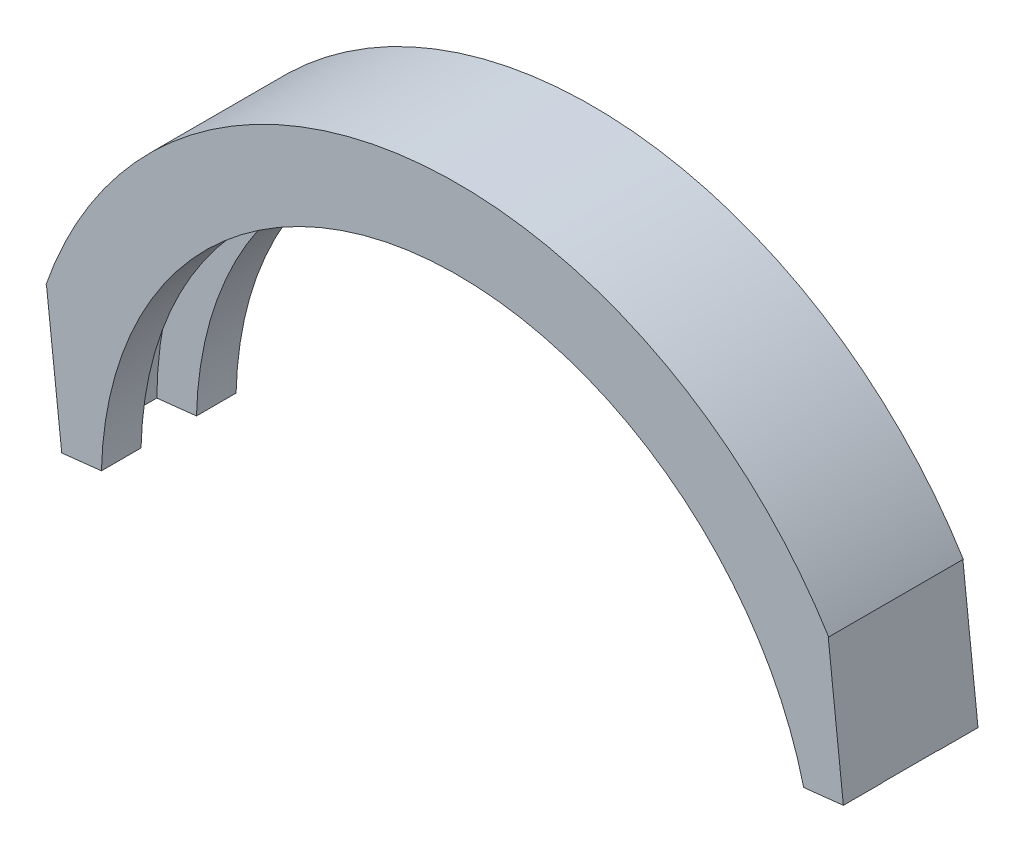
ISO-10303-21;
HEADER;
FILE_DESCRIPTION(('STEP AP214'),'2;1');
FILE_NAME('part.step','',(''),(''),'','','');
FILE_SCHEMA(('AUTOMOTIVE_DESIGN { 1 0 10303 214 1 1 1 1 }'));
ENDSEC;
DATA;
#1=APPLICATION_CONTEXT('core data for automotive mechanical design processes');
#2=APPLICATION_PROTOCOL_DEFINITION('international standard','automotive_design',2000,#1);
#3=PRODUCT_CONTEXT('',#1,'mechanical');
#4=PRODUCT('Part','Part','',(#3));
#5=PRODUCT_RELATED_PRODUCT_CATEGORY('part','',(#4));
#6=PRODUCT_DEFINITION_FORMATION('','',#4);
#7=PRODUCT_DEFINITION_CONTEXT('part definition',#1,'design');
#8=PRODUCT_DEFINITION('design','',#6,#7);
#9=PRODUCT_DEFINITION_SHAPE('','',#8);
#10=(LENGTH_UNIT() NAMED_UNIT(*) SI_UNIT(.MILLI.,.METRE.));
#11=(NAMED_UNIT(*) PLANE_ANGLE_UNIT() SI_UNIT($,.RADIAN.));
#12=(NAMED_UNIT(*) SI_UNIT($,.STERADIAN.) SOLID_ANGLE_UNIT());
#13=UNCERTAINTY_MEASURE_WITH_UNIT(LENGTH_MEASURE(1.E-05),#10,'distance_accuracy_value','');
#14=(GEOMETRIC_REPRESENTATION_CONTEXT(3) GLOBAL_UNCERTAINTY_ASSIGNED_CONTEXT((#13)) GLOBAL_UNIT_ASSIGNED_CONTEXT((#10,
#11,#12)) REPRESENTATION_CONTEXT('',''));
#15=CARTESIAN_POINT('',(0.,0.,0.));
#16=DIRECTION('',(0.,0.,1.));
#17=DIRECTION('',(1.,0.,0.));
#18=AXIS2_PLACEMENT_3D('',#15,#16,#17);
#19=CARTESIAN_POINT('',(0.,0.,-12.));
#20=DIRECTION('',(0.,0.,1.));
#21=DIRECTION('',(1.,0.,0.));
#22=AXIS2_PLACEMENT_3D('',#19,#20,#21);
#23=PLANE('',#22);
#24=DIRECTION('',(0.110190648825979,-0.993910469263359,0.));
#25=VECTOR('',#24,1.);
#26=CARTESIAN_POINT('',(-49.3299275026118,-5.46900036386577,-12.));
#27=LINE('',#26,#25);
#28=CARTESIAN_POINT('',(-51.9278912070833,17.9644157395125,-12.));
#29=VERTEX_POINT('',#28);
#30=CARTESIAN_POINT('',(-49.9969977700962,0.547917856065426,-12.));
#31=VERTEX_POINT('',#30);
#32=EDGE_CURVE('E158',#29,#31,#27,.T.);
#33=ORIENTED_EDGE('',*,*,#32,.F.);
#34=DIRECTION('',(-0.993910469263359,-0.110190648825979,0.));
#35=VECTOR('',#34,1.);
#36=CARTESIAN_POINT('',(-2.59796370447145,23.4334161033783,-12.));
#37=LINE('',#36,#35);
#38=CARTESIAN_POINT('',(-51.9856698972341,17.9580100605777,-12.));
#39=VERTEX_POINT('',#38);
#40=EDGE_CURVE('E201',#29,#39,#37,.T.);
#41=ORIENTED_EDGE('',*,*,#40,.T.);
#42=CARTESIAN_POINT('',(0.,0.,-12.));
#43=DIRECTION('',(0.,0.,1.));
#44=DIRECTION('',(1.,0.,0.));
#45=AXIS2_PLACEMENT_3D('',#42,#43,#44);
#46=CIRCLE('',#45,55.);
#47=CARTESIAN_POINT('',(46.8322187327878,28.8399599265379,-12.));
#48=VERTEX_POINT('',#47);
#49=EDGE_CURVE('E177',#48,#39,#46,.T.);
#50=ORIENTED_EDGE('',*,*,#49,.F.);
#51=DIRECTION('',(-0.994056338222314,-0.108866874852014,0.));
#52=VECTOR('',#51,1.);
#53=CARTESIAN_POINT('',(-2.56599960654614,23.4299751529607,-12.));
#54=LINE('',#53,#52);
#55=CARTESIAN_POINT('',(46.7754583572145,28.8337436544148,-12.));
#56=VERTEX_POINT('',#55);
#57=EDGE_CURVE('E200',#48,#56,#54,.T.);
#58=ORIENTED_EDGE('',*,*,#57,.T.);
#59=DIRECTION('',(0.108866874852013,-0.994056338222314,0.));
#60=VECTOR('',#59,1.);
#61=CARTESIAN_POINT('',(49.3414579637606,5.40376850145415,-12.));
#62=LINE('',#61,#60);
#63=CARTESIAN_POINT('',(48.6895981595588,11.3558578847492,-12.));
#64=VERTEX_POINT('',#63);
#65=EDGE_CURVE('E220',#56,#64,#62,.T.);
#66=ORIENTED_EDGE('',*,*,#65,.T.);
#67=DIRECTION('',(0.99405633822232,0.108866874851961,0.));
#68=VECTOR('',#67,1.);
#69=CARTESIAN_POINT('',(53.6962803915964,11.9041787665953,-12.));
#70=LINE('',#69,#68);
#71=CARTESIAN_POINT('',(43.6829159275211,10.8075370029031,-12.));
#72=VERTEX_POINT('',#71);
#73=EDGE_CURVE('E240',#72,#64,#70,.T.);
#74=ORIENTED_EDGE('',*,*,#73,.F.);
#75=CARTESIAN_POINT('',(0.,0.,-12.));
#76=DIRECTION('',(0.,0.,1.));
#77=DIRECTION('',(1.,0.,0.));
#78=AXIS2_PLACEMENT_3D('',#75,#76,#77);
#79=CIRCLE('',#78,45.);
#80=CARTESIAN_POINT('',(-44.9866355359247,1.09664176369223,-12.));
#81=VERTEX_POINT('',#80);
#82=EDGE_CURVE('E225',#81,#72,#79,.F.);
#83=ORIENTED_EDGE('',*,*,#82,.F.);
#84=EDGE_CURVE('E241',#31,#81,#70,.T.);
#85=ORIENTED_EDGE('',*,*,#84,.F.);
#86=EDGE_LOOP('',(#33,#41,#50,#58,#66,#74,#83,#85));
#87=FACE_BOUND('',#86,.T.);
#88=ADVANCED_FACE('F40',(#87),#23,.F.);
#89=CARTESIAN_POINT('',(0.,0.,5.));
#90=DIRECTION('',(0.,0.,-1.));
#91=DIRECTION('',(-1.,0.,0.));
#92=AXIS2_PLACEMENT_3D('',#89,#90,#91);
#93=PLANE('',#92);
#94=DIRECTION('',(-0.110190648825979,0.993910469263359,0.));
#95=VECTOR('',#94,1.);
#96=CARTESIAN_POINT('',(-49.3299275026118,-5.46900036386577,5.));
#97=LINE('',#96,#95);
#98=CARTESIAN_POINT('',(-49.9969977700962,0.547917856065426,5.));
#99=VERTEX_POINT('',#98);
#100=CARTESIAN_POINT('',(-51.9278912070833,17.9644157395125,5.));
#101=VERTEX_POINT('',#100);
#102=EDGE_CURVE('E139',#99,#101,#97,.T.);
#103=ORIENTED_EDGE('',*,*,#102,.F.);
#104=DIRECTION('',(-0.99405633822232,-0.108866874851961,0.));
#105=VECTOR('',#104,1.);
#106=CARTESIAN_POINT('',(-55.,0.,5.));
#107=LINE('',#106,#105);
#108=CARTESIAN_POINT('',(-44.9866355359247,1.09664176369223,5.));
#109=VERTEX_POINT('',#108);
#110=EDGE_CURVE('E154',#109,#99,#107,.T.);
#111=ORIENTED_EDGE('',*,*,#110,.F.);
#112=CARTESIAN_POINT('',(0.,0.,5.));
#113=DIRECTION('',(0.,0.,-1.));
#114=DIRECTION('',(-1.,0.,0.));
#115=AXIS2_PLACEMENT_3D('',#112,#113,#114);
#116=CIRCLE('',#115,45.);
#117=CARTESIAN_POINT('',(43.6829159275211,10.8075370029031,5.));
#118=VERTEX_POINT('',#117);
#119=EDGE_CURVE('E232',#118,#109,#116,.F.);
#120=ORIENTED_EDGE('',*,*,#119,.F.);
#121=CARTESIAN_POINT('',(48.6895981595588,11.3558578847492,5.));
#122=VERTEX_POINT('',#121);
#123=EDGE_CURVE('E163',#122,#118,#107,.T.);
#124=ORIENTED_EDGE('',*,*,#123,.F.);
#125=DIRECTION('',(-0.108866874852013,0.994056338222314,0.));
#126=VECTOR('',#125,1.);
#127=CARTESIAN_POINT('',(49.3414579637606,5.40376850145415,5.));
#128=LINE('',#127,#126);
#129=CARTESIAN_POINT('',(46.7754583572145,28.8337436544148,5.));
#130=VERTEX_POINT('',#129);
#131=EDGE_CURVE('E217',#122,#130,#128,.T.);
#132=ORIENTED_EDGE('',*,*,#131,.T.);
#133=DIRECTION('',(0.994056338222314,0.108866874852014,0.));
#134=VECTOR('',#133,1.);
#135=CARTESIAN_POINT('',(-2.56599960654614,23.4299751529607,5.));
#136=LINE('',#135,#134);
#137=CARTESIAN_POINT('',(46.8322187327878,28.8399599265379,5.));
#138=VERTEX_POINT('',#137);
#139=EDGE_CURVE('E222',#130,#138,#136,.T.);
#140=ORIENTED_EDGE('',*,*,#139,.T.);
#141=CARTESIAN_POINT('',(0.,0.,5.));
#142=DIRECTION('',(0.,0.,-1.));
#143=DIRECTION('',(-1.,0.,0.));
#144=AXIS2_PLACEMENT_3D('',#141,#142,#143);
#145=CIRCLE('',#144,55.);
#146=CARTESIAN_POINT('',(-51.9856698972341,17.9580100605777,5.));
#147=VERTEX_POINT('',#146);
#148=EDGE_CURVE('E176',#138,#147,#145,.F.);
#149=ORIENTED_EDGE('',*,*,#148,.T.);
#150=DIRECTION('',(0.993910469263359,0.110190648825979,0.));
#151=VECTOR('',#150,1.);
#152=CARTESIAN_POINT('',(-2.59796370447145,23.4334161033783,5.));
#153=LINE('',#152,#151);
#154=EDGE_CURVE('E157',#147,#101,#153,.T.);
#155=ORIENTED_EDGE('',*,*,#154,.T.);
#156=EDGE_LOOP('',(#103,#111,#120,#124,#132,#140,#149,#155));
#157=FACE_BOUND('',#156,.T.);
#158=ADVANCED_FACE('F42',(#157),#93,.F.);
#159=CARTESIAN_POINT('',(-55.,0.,179.999397209024));
#160=DIRECTION('',(-0.108866874851961,0.99405633822232,0.));
#161=DIRECTION('',(-0.99405633822232,-0.108866874851961,0.));
#162=AXIS2_PLACEMENT_3D('',#159,#160,#161);
#163=PLANE('',#162);
#164=ORIENTED_EDGE('',*,*,#110,.T.);
#165=DIRECTION('',(0.,0.,-1.));
#166=VECTOR('',#165,1.);
#167=CARTESIAN_POINT('',(-49.9969977700962,0.547917856065426,5.000012));
#168=LINE('',#167,#166);
#169=CARTESIAN_POINT('',(-49.9969977700962,0.547917856065426,0.));
#170=VERTEX_POINT('',#169);
#171=EDGE_CURVE('E135',#99,#170,#168,.T.);
#172=ORIENTED_EDGE('',*,*,#171,.T.);
#173=DIRECTION('',(0.99405633822232,0.108866874851961,0.));
#174=VECTOR('',#173,1.);
#175=CARTESIAN_POINT('',(-0.651859804201795,5.95208938329766,0.));
#176=LINE('',#175,#174);
#177=CARTESIAN_POINT('',(-44.9866355359247,1.09664176369222,0.));
#178=VERTEX_POINT('',#177);
#179=EDGE_CURVE('E182',#170,#178,#176,.T.);
#180=ORIENTED_EDGE('',*,*,#179,.T.);
#181=DIRECTION('',(0.,0.,-1.));
#182=VECTOR('',#181,1.);
#183=CARTESIAN_POINT('',(-44.9866355359247,1.09664176369222,179.999397209024));
#184=LINE('',#183,#182);
#185=EDGE_CURVE('E162',#109,#178,#184,.T.);
#186=ORIENTED_EDGE('',*,*,#185,.F.);
#187=EDGE_LOOP('',(#164,#172,#180,#186));
#188=FACE_BOUND('',#187,.T.);
#189=ADVANCED_FACE('F160',(#188),#163,.F.);
#190=ORIENTED_EDGE('',*,*,#73,.T.);
#191=DIRECTION('',(0.,0.,-1.));
#192=VECTOR('',#191,1.);
#193=CARTESIAN_POINT('',(48.6895981595588,11.3558578847492,5.000012));
#194=LINE('',#193,#192);
#195=CARTESIAN_POINT('',(48.6895981595588,11.3558578847492,-6.99999999999999));
#196=VERTEX_POINT('',#195);
#197=EDGE_CURVE('E204',#196,#64,#194,.T.);
#198=ORIENTED_EDGE('',*,*,#197,.F.);
#199=DIRECTION('',(-0.99405633822232,-0.108866874851961,0.));
#200=VECTOR('',#199,1.);
#201=CARTESIAN_POINT('',(-0.651859804201795,5.95208938329766,-7.));
#202=LINE('',#201,#200);
#203=CARTESIAN_POINT('',(43.6829159275211,10.8075370029031,-7.00000000000001));
#204=VERTEX_POINT('',#203);
#205=EDGE_CURVE('E164',#196,#204,#202,.T.);
#206=ORIENTED_EDGE('',*,*,#205,.T.);
#207=DIRECTION('',(0.,0.,1.));
#208=VECTOR('',#207,1.);
#209=CARTESIAN_POINT('',(43.6829159275211,10.8075370029031,-186.999397209024));
#210=LINE('',#209,#208);
#211=EDGE_CURVE('E63',#72,#204,#210,.T.);
#212=ORIENTED_EDGE('',*,*,#211,.F.);
#213=EDGE_LOOP('',(#190,#198,#206,#212));
#214=FACE_BOUND('',#213,.T.);
#215=ADVANCED_FACE('F247',(#214),#163,.F.);
#216=CARTESIAN_POINT('',(43.6829159275211,10.8075370029031,0.));
#217=VERTEX_POINT('',#216);
#218=CARTESIAN_POINT('',(48.6895981595588,11.3558578847492,0.));
#219=VERTEX_POINT('',#218);
#220=EDGE_CURVE('E180',#217,#219,#176,.T.);
#221=ORIENTED_EDGE('',*,*,#220,.T.);
#222=EDGE_CURVE('E55',#122,#219,#194,.T.);
#223=ORIENTED_EDGE('',*,*,#222,.F.);
#224=ORIENTED_EDGE('',*,*,#123,.T.);
#225=DIRECTION('',(0.,0.,-1.));
#226=VECTOR('',#225,1.);
#227=CARTESIAN_POINT('',(43.6829159275211,10.8075370029031,179.999397209024));
#228=LINE('',#227,#226);
#229=EDGE_CURVE('E234',#118,#217,#228,.T.);
#230=ORIENTED_EDGE('',*,*,#229,.T.);
#231=EDGE_LOOP('',(#221,#223,#224,#230));
#232=FACE_BOUND('',#231,.T.);
#233=ADVANCED_FACE('F269',(#232),#163,.F.);
#234=CARTESIAN_POINT('',(-44.9866355359247,1.09664176369223,-7.00000000000001));
#235=VERTEX_POINT('',#234);
#236=CARTESIAN_POINT('',(-49.9969977700962,0.547917856065425,-6.99999999999999));
#237=VERTEX_POINT('',#236);
#238=EDGE_CURVE('E166',#235,#237,#202,.T.);
#239=ORIENTED_EDGE('',*,*,#238,.T.);
#240=EDGE_CURVE('E148',#237,#31,#168,.T.);
#241=ORIENTED_EDGE('',*,*,#240,.T.);
#242=ORIENTED_EDGE('',*,*,#84,.T.);
#243=DIRECTION('',(0.,0.,1.));
#244=VECTOR('',#243,1.);
#245=CARTESIAN_POINT('',(-44.9866355359247,1.09664176369223,-186.999397209024));
#246=LINE('',#245,#244);
#247=EDGE_CURVE('E228',#81,#235,#246,.T.);
#248=ORIENTED_EDGE('',*,*,#247,.T.);
#249=EDGE_LOOP('',(#239,#241,#242,#248));
#250=FACE_BOUND('',#249,.T.);
#251=ADVANCED_FACE('F253',(#250),#163,.F.);
#252=CARTESIAN_POINT('',(0.,0.,0.));
#253=DIRECTION('',(0.,0.,1.));
#254=DIRECTION('',(1.,0.,0.));
#255=AXIS2_PLACEMENT_3D('',#252,#253,#254);
#256=CYLINDRICAL_SURFACE('',#255,55.);
#257=ORIENTED_EDGE('',*,*,#49,.T.);
#258=DIRECTION('',(0.,0.,1.));
#259=VECTOR('',#258,1.);
#260=CARTESIAN_POINT('',(-51.9856698972341,17.9580100605777,0.));
#261=LINE('',#260,#259);
#262=EDGE_CURVE('E11',#39,#147,#261,.T.);
#263=ORIENTED_EDGE('',*,*,#262,.T.);
#264=ORIENTED_EDGE('',*,*,#148,.F.);
#265=DIRECTION('',(0.,0.,1.));
#266=VECTOR('',#265,1.);
#267=CARTESIAN_POINT('',(46.8322187327878,28.8399599265379,0.));
#268=LINE('',#267,#266);
#269=EDGE_CURVE('E48',#138,#48,#268,.F.);
#270=ORIENTED_EDGE('',*,*,#269,.T.);
#271=EDGE_LOOP('',(#257,#263,#264,#270));
#272=FACE_BOUND('',#271,.T.);
#273=ADVANCED_FACE('F192',(#272),#256,.T.);
#274=CARTESIAN_POINT('',(0.,0.,-7.));
#275=DIRECTION('',(0.,0.,1.));
#276=DIRECTION('',(1.,0.,0.));
#277=AXIS2_PLACEMENT_3D('',#274,#275,#276);
#278=PLANE('',#277);
#279=DIRECTION('',(0.108866874852013,-0.994056338222314,0.));
#280=VECTOR('',#279,1.);
#281=CARTESIAN_POINT('',(49.3414579637606,5.40376850145415,-7.));
#282=LINE('',#281,#280);
#283=CARTESIAN_POINT('',(48.6862655623992,11.3862876121915,-6.99999999999999));
#284=VERTEX_POINT('',#283);
#285=EDGE_CURVE('E215',#284,#196,#282,.T.);
#286=ORIENTED_EDGE('',*,*,#285,.F.);
#287=CARTESIAN_POINT('',(0.,0.,-6.99999999999999));
#288=DIRECTION('',(0.,0.,1.));
#289=DIRECTION('',(1.,0.,0.));
#290=AXIS2_PLACEMENT_3D('',#287,#288,#289);
#291=CIRCLE('',#290,50.);
#292=EDGE_CURVE('E173',#284,#237,#291,.T.);
#293=ORIENTED_EDGE('',*,*,#292,.T.);
#294=ORIENTED_EDGE('',*,*,#238,.F.);
#295=CARTESIAN_POINT('',(0.,0.,-7.00000000000001));
#296=DIRECTION('',(0.,0.,1.));
#297=DIRECTION('',(1.,0.,0.));
#298=AXIS2_PLACEMENT_3D('',#295,#296,#297);
#299=CIRCLE('',#298,45.);
#300=EDGE_CURVE('E184',#204,#235,#299,.T.);
#301=ORIENTED_EDGE('',*,*,#300,.F.);
#302=ORIENTED_EDGE('',*,*,#205,.F.);
#303=EDGE_LOOP('',(#286,#293,#294,#301,#302));
#304=FACE_BOUND('',#303,.T.);
#305=ADVANCED_FACE('F273',(#304),#278,.T.);
#306=CARTESIAN_POINT('',(0.,0.,0.));
#307=DIRECTION('',(0.,0.,1.));
#308=DIRECTION('',(1.,0.,0.));
#309=AXIS2_PLACEMENT_3D('',#306,#307,#308);
#310=CYLINDRICAL_SURFACE('',#309,50.);
#311=DIRECTION('',(0.,0.,1.));
#312=VECTOR('',#311,1.);
#313=CARTESIAN_POINT('',(48.6862655623992,11.3862876121915,0.));
#314=LINE('',#313,#312);
#315=CARTESIAN_POINT('',(48.6862655623992,11.3862876121913,0.));
#316=VERTEX_POINT('',#315);
#317=EDGE_CURVE('E213',#316,#284,#314,.F.);
#318=ORIENTED_EDGE('',*,*,#317,.F.);
#319=CARTESIAN_POINT('',(0.,0.,0.));
#320=DIRECTION('',(0.,0.,1.));
#321=DIRECTION('',(1.,0.,0.));
#322=AXIS2_PLACEMENT_3D('',#319,#320,#321);
#323=CIRCLE('',#322,50.);
#324=EDGE_CURVE('E171',#316,#170,#323,.T.);
#325=ORIENTED_EDGE('',*,*,#324,.T.);
#326=DIRECTION('',(0.,0.,1.));
#327=VECTOR('',#326,1.);
#328=CARTESIAN_POINT('',(-49.9969977700962,0.547917856065426,0.));
#329=LINE('',#328,#327);
#330=EDGE_CURVE('E142',#237,#170,#329,.T.);
#331=ORIENTED_EDGE('',*,*,#330,.F.);
#332=ORIENTED_EDGE('',*,*,#292,.F.);
#333=EDGE_LOOP('',(#318,#325,#331,#332));
#334=FACE_BOUND('',#333,.T.);
#335=ADVANCED_FACE('F258',(#334),#310,.F.);
#336=CARTESIAN_POINT('',(0.,0.,0.));
#337=DIRECTION('',(0.,0.,-1.));
#338=DIRECTION('',(-1.,0.,0.));
#339=AXIS2_PLACEMENT_3D('',#336,#337,#338);
#340=PLANE('',#339);
#341=DIRECTION('',(-0.108866874852013,0.994056338222314,0.));
#342=VECTOR('',#341,1.);
#343=CARTESIAN_POINT('',(49.3414579637606,5.40376850145415,0.));
#344=LINE('',#343,#342);
#345=EDGE_CURVE('E187',#219,#316,#344,.T.);
#346=ORIENTED_EDGE('',*,*,#345,.F.);
#347=ORIENTED_EDGE('',*,*,#220,.F.);
#348=CARTESIAN_POINT('',(0.,0.,0.));
#349=DIRECTION('',(0.,0.,-1.));
#350=DIRECTION('',(-1.,0.,0.));
#351=AXIS2_PLACEMENT_3D('',#348,#349,#350);
#352=CIRCLE('',#351,45.);
#353=EDGE_CURVE('E238',#178,#217,#352,.T.);
#354=ORIENTED_EDGE('',*,*,#353,.F.);
#355=ORIENTED_EDGE('',*,*,#179,.F.);
#356=ORIENTED_EDGE('',*,*,#324,.F.);
#357=EDGE_LOOP('',(#346,#347,#354,#355,#356));
#358=FACE_BOUND('',#357,.T.);
#359=ADVANCED_FACE('F262',(#358),#340,.T.);
#360=CARTESIAN_POINT('',(0.,0.,179.999397209024));
#361=DIRECTION('',(0.,0.,-1.));
#362=DIRECTION('',(-1.,0.,0.));
#363=AXIS2_PLACEMENT_3D('',#360,#361,#362);
#364=CYLINDRICAL_SURFACE('',#363,45.);
#365=ORIENTED_EDGE('',*,*,#185,.T.);
#366=ORIENTED_EDGE('',*,*,#353,.T.);
#367=ORIENTED_EDGE('',*,*,#229,.F.);
#368=ORIENTED_EDGE('',*,*,#119,.T.);
#369=EDGE_LOOP('',(#365,#366,#367,#368));
#370=FACE_BOUND('',#369,.T.);
#371=ADVANCED_FACE('F264',(#370),#364,.F.);
#372=CARTESIAN_POINT('',(0.,0.,-186.999397209024));
#373=DIRECTION('',(0.,0.,1.));
#374=DIRECTION('',(1.,0.,0.));
#375=AXIS2_PLACEMENT_3D('',#372,#373,#374);
#376=CYLINDRICAL_SURFACE('',#375,45.);
#377=ORIENTED_EDGE('',*,*,#211,.T.);
#378=ORIENTED_EDGE('',*,*,#300,.T.);
#379=ORIENTED_EDGE('',*,*,#247,.F.);
#380=ORIENTED_EDGE('',*,*,#82,.T.);
#381=EDGE_LOOP('',(#377,#378,#379,#380));
#382=FACE_BOUND('',#381,.T.);
#383=ADVANCED_FACE('F251',(#382),#376,.F.);
#384=CARTESIAN_POINT('',(46.7754583572145,28.8337436544148,5.000012));
#385=DIRECTION('',(-0.108866874852014,0.994056338222314,0.));
#386=DIRECTION('',(-0.994056338222314,-0.108866874852014,0.));
#387=AXIS2_PLACEMENT_3D('',#384,#385,#386);
#388=PLANE('',#387);
#389=ORIENTED_EDGE('',*,*,#269,.F.);
#390=ORIENTED_EDGE('',*,*,#139,.F.);
#391=DIRECTION('',(0.,0.,-1.));
#392=VECTOR('',#391,1.);
#393=CARTESIAN_POINT('',(46.7754583572145,28.8337436544148,5.000012));
#394=LINE('',#393,#392);
#395=EDGE_CURVE('E210',#130,#56,#394,.T.);
#396=ORIENTED_EDGE('',*,*,#395,.T.);
#397=ORIENTED_EDGE('',*,*,#57,.F.);
#398=EDGE_LOOP('',(#389,#390,#396,#397));
#399=FACE_BOUND('',#398,.T.);
#400=ADVANCED_FACE('F311',(#399),#388,.F.);
#401=CARTESIAN_POINT('',(48.6895981595588,11.3558578847492,5.000012));
#402=DIRECTION('',(-0.994056338222314,-0.108866874852013,0.));
#403=DIRECTION('',(0.108866874852013,-0.994056338222314,0.));
#404=AXIS2_PLACEMENT_3D('',#401,#402,#403);
#405=PLANE('',#404);
#406=ORIENTED_EDGE('',*,*,#395,.F.);
#407=ORIENTED_EDGE('',*,*,#131,.F.);
#408=ORIENTED_EDGE('',*,*,#222,.T.);
#409=ORIENTED_EDGE('',*,*,#345,.T.);
#410=ORIENTED_EDGE('',*,*,#317,.T.);
#411=ORIENTED_EDGE('',*,*,#285,.T.);
#412=ORIENTED_EDGE('',*,*,#197,.T.);
#413=ORIENTED_EDGE('',*,*,#65,.F.);
#414=EDGE_LOOP('',(#406,#407,#408,#409,#410,#411,#412,#413));
#415=FACE_BOUND('',#414,.T.);
#416=ADVANCED_FACE('F271',(#415),#405,.F.);
#417=CARTESIAN_POINT('',(-61.8669958997168,16.8625092512527,5.000012));
#418=DIRECTION('',(-0.110190648825979,0.993910469263359,0.));
#419=DIRECTION('',(-0.993910469263359,-0.110190648825979,0.));
#420=AXIS2_PLACEMENT_3D('',#417,#418,#419);
#421=PLANE('',#420);
#422=DIRECTION('',(0.,0.,-1.));
#423=VECTOR('',#422,1.);
#424=CARTESIAN_POINT('',(-51.9278912070833,17.9644157395125,5.000012));
#425=LINE('',#424,#423);
#426=EDGE_CURVE('E147',#101,#29,#425,.T.);
#427=ORIENTED_EDGE('',*,*,#426,.F.);
#428=ORIENTED_EDGE('',*,*,#154,.F.);
#429=ORIENTED_EDGE('',*,*,#262,.F.);
#430=ORIENTED_EDGE('',*,*,#40,.F.);
#431=EDGE_LOOP('',(#427,#428,#429,#430));
#432=FACE_BOUND('',#431,.T.);
#433=ADVANCED_FACE('F324',(#432),#421,.F.);
#434=CARTESIAN_POINT('',(-49.9969977700962,0.547917856065426,5.000012));
#435=DIRECTION('',(-0.993910469263359,-0.110190648825979,0.));
#436=DIRECTION('',(0.110190648825979,-0.993910469263359,0.));
#437=AXIS2_PLACEMENT_3D('',#434,#435,#436);
#438=PLANE('',#437);
#439=ORIENTED_EDGE('',*,*,#32,.T.);
#440=ORIENTED_EDGE('',*,*,#240,.F.);
#441=ORIENTED_EDGE('',*,*,#330,.T.);
#442=ORIENTED_EDGE('',*,*,#171,.F.);
#443=ORIENTED_EDGE('',*,*,#102,.T.);
#444=ORIENTED_EDGE('',*,*,#426,.T.);
#445=EDGE_LOOP('',(#439,#440,#441,#442,#443,#444));
#446=FACE_BOUND('',#445,.T.);
#447=ADVANCED_FACE('F137',(#446),#438,.T.);
#448=CLOSED_SHELL('',(#88,#158,#189,#215,#233,#251,#273,#305,#335,#359,#371,#383,#400,#416,#433,#447));
#449=MANIFOLD_SOLID_BREP('B2',#448);
#450=ADVANCED_BREP_SHAPE_REPRESENTATION('',(#18,#449),#14);
#451=SHAPE_DEFINITION_REPRESENTATION(#9,#450);
ENDSEC;
END-ISO-10303-21;
